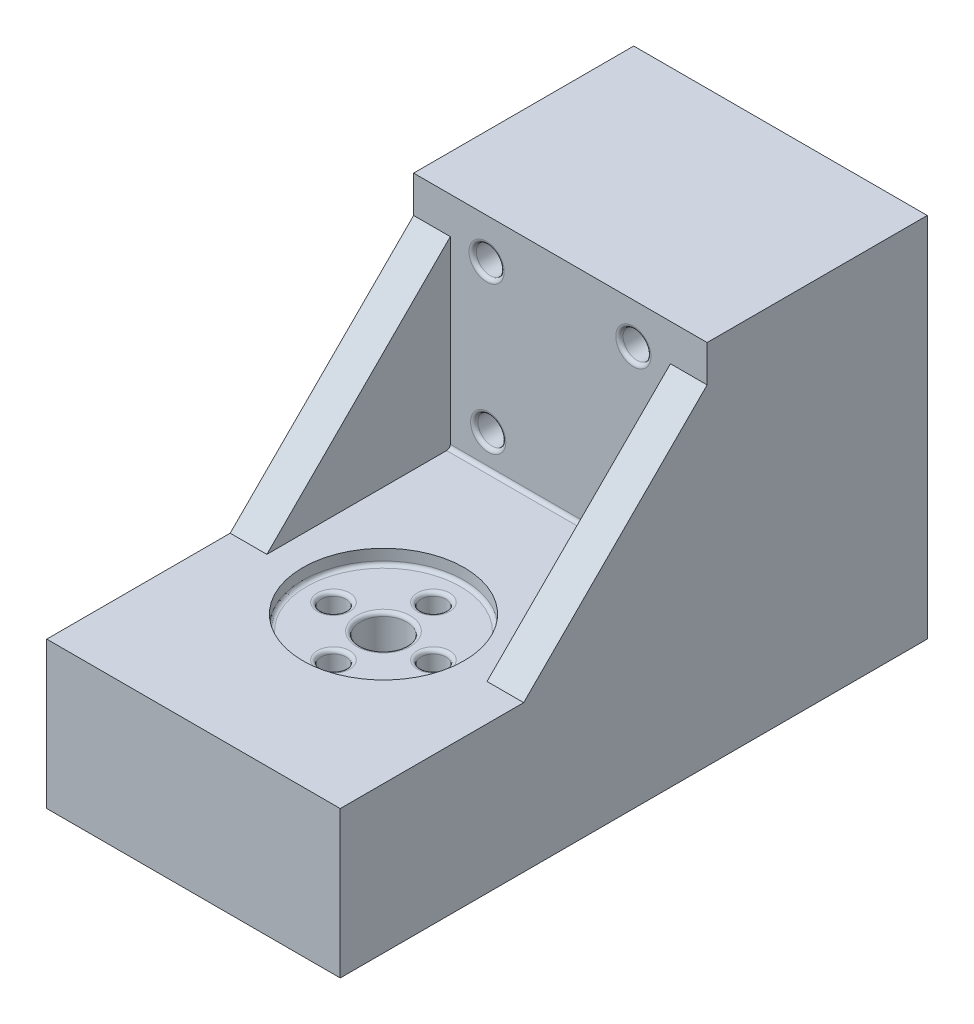
ISO-10303-21;
HEADER;
FILE_DESCRIPTION(('STEP AP214'),'2;1');
FILE_NAME('part.step','',(''),(''),'','','');
FILE_SCHEMA(('AUTOMOTIVE_DESIGN { 1 0 10303 214 1 1 1 1 }'));
ENDSEC;
DATA;
#1=APPLICATION_CONTEXT('core data for automotive mechanical design processes');
#2=APPLICATION_PROTOCOL_DEFINITION('international standard','automotive_design',2000,#1);
#3=PRODUCT_CONTEXT('',#1,'mechanical');
#4=PRODUCT('Part','Part','',(#3));
#5=PRODUCT_RELATED_PRODUCT_CATEGORY('part','',(#4));
#6=PRODUCT_DEFINITION_FORMATION('','',#4);
#7=PRODUCT_DEFINITION_CONTEXT('part definition',#1,'design');
#8=PRODUCT_DEFINITION('design','',#6,#7);
#9=PRODUCT_DEFINITION_SHAPE('','',#8);
#10=(LENGTH_UNIT() NAMED_UNIT(*) SI_UNIT(.MILLI.,.METRE.));
#11=(NAMED_UNIT(*) PLANE_ANGLE_UNIT() SI_UNIT($,.RADIAN.));
#12=(NAMED_UNIT(*) SI_UNIT($,.STERADIAN.) SOLID_ANGLE_UNIT());
#13=UNCERTAINTY_MEASURE_WITH_UNIT(LENGTH_MEASURE(1.E-05),#10,'distance_accuracy_value','');
#14=(GEOMETRIC_REPRESENTATION_CONTEXT(3) GLOBAL_UNCERTAINTY_ASSIGNED_CONTEXT((#13)) GLOBAL_UNIT_ASSIGNED_CONTEXT((#10,
#11,#12)) REPRESENTATION_CONTEXT('',''));
#15=CARTESIAN_POINT('',(0.,0.,0.));
#16=DIRECTION('',(0.,0.,1.));
#17=DIRECTION('',(1.,0.,0.));
#18=AXIS2_PLACEMENT_3D('',#15,#16,#17);
#19=CARTESIAN_POINT('',(5.,0.,0.));
#20=DIRECTION('',(1.,0.,0.));
#21=DIRECTION('',(0.,0.,-1.));
#22=AXIS2_PLACEMENT_3D('',#19,#20,#21);
#23=PLANE('',#22);
#24=DIRECTION('',(0.,0.,-1.));
#25=VECTOR('',#24,1.);
#26=CARTESIAN_POINT('',(5.,20.,0.));
#27=LINE('',#26,#25);
#28=CARTESIAN_POINT('',(5.,20.,25.));
#29=VERTEX_POINT('',#28);
#30=CARTESIAN_POINT('',(5.,20.,0.5));
#31=VERTEX_POINT('',#30);
#32=EDGE_CURVE('E66',#29,#31,#27,.T.);
#33=ORIENTED_EDGE('',*,*,#32,.T.);
#34=CARTESIAN_POINT('',(5.,20.5,0.5));
#35=DIRECTION('',(1.,0.,0.));
#36=DIRECTION('',(0.,0.,-1.));
#37=AXIS2_PLACEMENT_3D('',#34,#35,#36);
#38=CIRCLE('',#37,0.5);
#39=CARTESIAN_POINT('',(5.,20.5,0.));
#40=VERTEX_POINT('',#39);
#41=EDGE_CURVE('E273',#31,#40,#38,.T.);
#42=ORIENTED_EDGE('',*,*,#41,.T.);
#43=DIRECTION('',(0.,1.,0.));
#44=VECTOR('',#43,1.);
#45=CARTESIAN_POINT('',(5.,20.,0.));
#46=LINE('',#45,#44);
#47=CARTESIAN_POINT('',(5.,45.,0.));
#48=VERTEX_POINT('',#47);
#49=EDGE_CURVE('E285',#40,#48,#46,.T.);
#50=ORIENTED_EDGE('',*,*,#49,.T.);
#51=DIRECTION('',(0.,-0.707106781186547,0.707106781186548));
#52=VECTOR('',#51,1.);
#53=CARTESIAN_POINT('',(5.,20.,25.));
#54=LINE('',#53,#52);
#55=EDGE_CURVE('E278',#48,#29,#54,.T.);
#56=ORIENTED_EDGE('',*,*,#55,.T.);
#57=EDGE_LOOP('',(#33,#42,#50,#56));
#58=FACE_BOUND('',#57,.T.);
#59=ADVANCED_FACE('F50',(#58),#23,.T.);
#60=CARTESIAN_POINT('',(5.,20.,25.));
#61=DIRECTION('',(0.,-0.707106781186548,-0.707106781186547));
#62=DIRECTION('',(0.,0.707106781186547,-0.707106781186548));
#63=AXIS2_PLACEMENT_3D('',#60,#61,#62);
#64=PLANE('',#63);
#65=DIRECTION('',(0.,-0.707106781186547,0.707106781186548));
#66=VECTOR('',#65,1.);
#67=CARTESIAN_POINT('',(0.,20.,25.));
#68=LINE('',#67,#66);
#69=CARTESIAN_POINT('',(0.,45.,0.));
#70=VERTEX_POINT('',#69);
#71=CARTESIAN_POINT('',(0.,20.,25.));
#72=VERTEX_POINT('',#71);
#73=EDGE_CURVE('E279',#70,#72,#68,.T.);
#74=ORIENTED_EDGE('',*,*,#73,.T.);
#75=DIRECTION('',(-1.,0.,0.));
#76=VECTOR('',#75,1.);
#77=CARTESIAN_POINT('',(5.,20.,25.));
#78=LINE('',#77,#76);
#79=EDGE_CURVE('E11',#29,#72,#78,.T.);
#80=ORIENTED_EDGE('',*,*,#79,.F.);
#81=ORIENTED_EDGE('',*,*,#55,.F.);
#82=DIRECTION('',(-1.,0.,0.));
#83=VECTOR('',#82,1.);
#84=CARTESIAN_POINT('',(5.,45.,0.));
#85=LINE('',#84,#83);
#86=EDGE_CURVE('E54',#48,#70,#85,.T.);
#87=ORIENTED_EDGE('',*,*,#86,.T.);
#88=EDGE_LOOP('',(#74,#80,#81,#87));
#89=FACE_BOUND('',#88,.T.);
#90=ADVANCED_FACE('F47',(#89),#64,.F.);
#91=CARTESIAN_POINT('',(0.,0.,0.));
#92=DIRECTION('',(1.,0.,0.));
#93=DIRECTION('',(0.,0.,-1.));
#94=AXIS2_PLACEMENT_3D('',#91,#92,#93);
#95=PLANE('',#94);
#96=ORIENTED_EDGE('',*,*,#73,.F.);
#97=DIRECTION('',(0.,1.,0.));
#98=VECTOR('',#97,1.);
#99=CARTESIAN_POINT('',(0.,0.,0.));
#100=LINE('',#99,#98);
#101=CARTESIAN_POINT('',(0.,50.,0.));
#102=VERTEX_POINT('',#101);
#103=EDGE_CURVE('E158',#70,#102,#100,.T.);
#104=ORIENTED_EDGE('',*,*,#103,.T.);
#105=DIRECTION('',(0.,0.,1.));
#106=VECTOR('',#105,1.);
#107=CARTESIAN_POINT('',(0.,50.,-30.));
#108=LINE('',#107,#106);
#109=CARTESIAN_POINT('',(0.,50.,-30.));
#110=VERTEX_POINT('',#109);
#111=EDGE_CURVE('E173',#110,#102,#108,.T.);
#112=ORIENTED_EDGE('',*,*,#111,.F.);
#113=DIRECTION('',(0.,1.,0.));
#114=VECTOR('',#113,1.);
#115=CARTESIAN_POINT('',(0.,0.,-30.));
#116=LINE('',#115,#114);
#117=CARTESIAN_POINT('',(0.,0.,-30.));
#118=VERTEX_POINT('',#117);
#119=EDGE_CURVE('E150',#118,#110,#116,.T.);
#120=ORIENTED_EDGE('',*,*,#119,.F.);
#121=DIRECTION('',(0.,0.,-1.));
#122=VECTOR('',#121,1.);
#123=CARTESIAN_POINT('',(0.,0.,50.));
#124=LINE('',#123,#122);
#125=CARTESIAN_POINT('',(0.,0.,50.));
#126=VERTEX_POINT('',#125);
#127=EDGE_CURVE('E142',#126,#118,#124,.T.);
#128=ORIENTED_EDGE('',*,*,#127,.F.);
#129=DIRECTION('',(0.,-1.,0.));
#130=VECTOR('',#129,1.);
#131=CARTESIAN_POINT('',(0.,0.,50.));
#132=LINE('',#131,#130);
#133=CARTESIAN_POINT('',(0.,20.,50.));
#134=VERTEX_POINT('',#133);
#135=EDGE_CURVE('E185',#134,#126,#132,.T.);
#136=ORIENTED_EDGE('',*,*,#135,.F.);
#137=DIRECTION('',(0.,0.,-1.));
#138=VECTOR('',#137,1.);
#139=CARTESIAN_POINT('',(0.,20.,50.));
#140=LINE('',#139,#138);
#141=EDGE_CURVE('E188',#134,#72,#140,.T.);
#142=ORIENTED_EDGE('',*,*,#141,.T.);
#143=EDGE_LOOP('',(#96,#104,#112,#120,#128,#136,#142));
#144=FACE_BOUND('',#143,.T.);
#145=ADVANCED_FACE('F291',(#144),#95,.F.);
#146=CARTESIAN_POINT('',(0.,0.,0.));
#147=DIRECTION('',(0.,0.,1.));
#148=DIRECTION('',(1.,0.,0.));
#149=AXIS2_PLACEMENT_3D('',#146,#147,#148);
#150=PLANE('',#149);
#151=CARTESIAN_POINT('',(30.1625461377643,24.5208644291387,0.));
#152=DIRECTION('',(0.,0.,1.));
#153=DIRECTION('',(1.,0.,0.));
#154=AXIS2_PLACEMENT_3D('',#151,#152,#153);
#155=CIRCLE('',#154,2.39724105008004);
#156=CARTESIAN_POINT('',(32.5597871878444,24.5208644291387,0.));
#157=VERTEX_POINT('',#156);
#158=EDGE_CURVE('E210',#157,#157,#155,.F.);
#159=ORIENTED_EDGE('',*,*,#158,.T.);
#160=EDGE_LOOP('',(#159));
#161=FACE_BOUND('',#160,.T.);
#162=CARTESIAN_POINT('',(29.9459523419828,44.5196915729393,0.));
#163=DIRECTION('',(0.,0.,1.));
#164=DIRECTION('',(1.,0.,0.));
#165=AXIS2_PLACEMENT_3D('',#162,#163,#164);
#166=CIRCLE('',#165,2.39724105008004);
#167=CARTESIAN_POINT('',(32.3431933920629,44.5196915729393,0.));
#168=VERTEX_POINT('',#167);
#169=EDGE_CURVE('E202',#168,#168,#166,.F.);
#170=ORIENTED_EDGE('',*,*,#169,.T.);
#171=EDGE_LOOP('',(#170));
#172=FACE_BOUND('',#171,.T.);
#173=CARTESIAN_POINT('',(9.94595234198282,44.519691572939,0.));
#174=DIRECTION('',(0.,0.,1.));
#175=DIRECTION('',(1.,0.,0.));
#176=AXIS2_PLACEMENT_3D('',#173,#174,#175);
#177=CIRCLE('',#176,2.39724105008004);
#178=CARTESIAN_POINT('',(12.3431933920629,44.519691572939,0.));
#179=VERTEX_POINT('',#178);
#180=EDGE_CURVE('E201',#179,#179,#177,.F.);
#181=ORIENTED_EDGE('',*,*,#180,.T.);
#182=EDGE_LOOP('',(#181));
#183=FACE_BOUND('',#182,.T.);
#184=CARTESIAN_POINT('',(10.1625461377643,24.5208644291384,0.));
#185=DIRECTION('',(0.,0.,1.));
#186=DIRECTION('',(1.,0.,0.));
#187=AXIS2_PLACEMENT_3D('',#184,#185,#186);
#188=CIRCLE('',#187,2.39724105008004);
#189=CARTESIAN_POINT('',(12.5597871878444,24.5208644291384,0.));
#190=VERTEX_POINT('',#189);
#191=EDGE_CURVE('E199',#190,#190,#188,.F.);
#192=ORIENTED_EDGE('',*,*,#191,.T.);
#193=EDGE_LOOP('',(#192));
#194=FACE_BOUND('',#193,.T.);
#195=ORIENTED_EDGE('',*,*,#86,.F.);
#196=ORIENTED_EDGE('',*,*,#49,.F.);
#197=DIRECTION('',(-1.,0.,0.));
#198=VECTOR('',#197,1.);
#199=CARTESIAN_POINT('',(0.,20.5,0.));
#200=LINE('',#199,#198);
#201=CARTESIAN_POINT('',(35.,20.5,0.));
#202=VERTEX_POINT('',#201);
#203=EDGE_CURVE('E62',#40,#202,#200,.F.);
#204=ORIENTED_EDGE('',*,*,#203,.T.);
#205=DIRECTION('',(0.,-1.,0.));
#206=VECTOR('',#205,1.);
#207=CARTESIAN_POINT('',(35.,20.,0.));
#208=LINE('',#207,#206);
#209=CARTESIAN_POINT('',(35.,45.,0.));
#210=VERTEX_POINT('',#209);
#211=EDGE_CURVE('E261',#210,#202,#208,.T.);
#212=ORIENTED_EDGE('',*,*,#211,.F.);
#213=DIRECTION('',(1.,0.,0.));
#214=VECTOR('',#213,1.);
#215=CARTESIAN_POINT('',(35.,45.,0.));
#216=LINE('',#215,#214);
#217=CARTESIAN_POINT('',(40.,45.,0.));
#218=VERTEX_POINT('',#217);
#219=EDGE_CURVE('E275',#210,#218,#216,.T.);
#220=ORIENTED_EDGE('',*,*,#219,.T.);
#221=DIRECTION('',(0.,-1.,0.));
#222=VECTOR('',#221,1.);
#223=CARTESIAN_POINT('',(40.,0.,0.));
#224=LINE('',#223,#222);
#225=CARTESIAN_POINT('',(40.,50.,0.));
#226=VERTEX_POINT('',#225);
#227=EDGE_CURVE('E170',#226,#218,#224,.T.);
#228=ORIENTED_EDGE('',*,*,#227,.F.);
#229=DIRECTION('',(1.,0.,0.));
#230=VECTOR('',#229,1.);
#231=CARTESIAN_POINT('',(40.,50.,0.));
#232=LINE('',#231,#230);
#233=EDGE_CURVE('E156',#102,#226,#232,.T.);
#234=ORIENTED_EDGE('',*,*,#233,.F.);
#235=ORIENTED_EDGE('',*,*,#103,.F.);
#236=EDGE_LOOP('',(#195,#196,#204,#212,#220,#228,#234,#235));
#237=FACE_BOUND('',#236,.T.);
#238=ADVANCED_FACE('F307',(#161,#172,#183,#194,#237),#150,.T.);
#239=CARTESIAN_POINT('',(35.,0.,0.));
#240=DIRECTION('',(1.,0.,0.));
#241=DIRECTION('',(0.,0.,-1.));
#242=AXIS2_PLACEMENT_3D('',#239,#240,#241);
#243=PLANE('',#242);
#244=CARTESIAN_POINT('',(35.,20.5,0.5));
#245=DIRECTION('',(1.,0.,0.));
#246=DIRECTION('',(0.,0.,-1.));
#247=AXIS2_PLACEMENT_3D('',#244,#245,#246);
#248=CIRCLE('',#247,0.5);
#249=CARTESIAN_POINT('',(35.,20.,0.5));
#250=VERTEX_POINT('',#249);
#251=EDGE_CURVE('E258',#250,#202,#248,.T.);
#252=ORIENTED_EDGE('',*,*,#251,.F.);
#253=DIRECTION('',(0.,0.,1.));
#254=VECTOR('',#253,1.);
#255=CARTESIAN_POINT('',(35.,20.,0.));
#256=LINE('',#255,#254);
#257=CARTESIAN_POINT('',(35.,20.,25.));
#258=VERTEX_POINT('',#257);
#259=EDGE_CURVE('E270',#250,#258,#256,.T.);
#260=ORIENTED_EDGE('',*,*,#259,.T.);
#261=DIRECTION('',(0.,0.707106781186547,-0.707106781186548));
#262=VECTOR('',#261,1.);
#263=CARTESIAN_POINT('',(35.,20.,25.));
#264=LINE('',#263,#262);
#265=EDGE_CURVE('E265',#258,#210,#264,.T.);
#266=ORIENTED_EDGE('',*,*,#265,.T.);
#267=ORIENTED_EDGE('',*,*,#211,.T.);
#268=EDGE_LOOP('',(#252,#260,#266,#267));
#269=FACE_BOUND('',#268,.T.);
#270=ADVANCED_FACE('F315',(#269),#243,.F.);
#271=CARTESIAN_POINT('',(35.,20.,25.));
#272=DIRECTION('',(0.,-0.707106781186548,-0.707106781186547));
#273=DIRECTION('',(0.,0.707106781186547,-0.707106781186548));
#274=AXIS2_PLACEMENT_3D('',#271,#272,#273);
#275=PLANE('',#274);
#276=DIRECTION('',(0.,0.707106781186547,-0.707106781186548));
#277=VECTOR('',#276,1.);
#278=CARTESIAN_POINT('',(40.,20.,25.));
#279=LINE('',#278,#277);
#280=CARTESIAN_POINT('',(40.,20.,25.));
#281=VERTEX_POINT('',#280);
#282=EDGE_CURVE('E262',#281,#218,#279,.T.);
#283=ORIENTED_EDGE('',*,*,#282,.T.);
#284=ORIENTED_EDGE('',*,*,#219,.F.);
#285=ORIENTED_EDGE('',*,*,#265,.F.);
#286=DIRECTION('',(1.,0.,0.));
#287=VECTOR('',#286,1.);
#288=CARTESIAN_POINT('',(35.,20.,25.));
#289=LINE('',#288,#287);
#290=EDGE_CURVE('E267',#258,#281,#289,.T.);
#291=ORIENTED_EDGE('',*,*,#290,.T.);
#292=EDGE_LOOP('',(#283,#284,#285,#291));
#293=FACE_BOUND('',#292,.T.);
#294=ADVANCED_FACE('F306',(#293),#275,.F.);
#295=CARTESIAN_POINT('',(40.,0.,0.));
#296=DIRECTION('',(1.,0.,0.));
#297=DIRECTION('',(0.,0.,-1.));
#298=AXIS2_PLACEMENT_3D('',#295,#296,#297);
#299=PLANE('',#298);
#300=ORIENTED_EDGE('',*,*,#282,.F.);
#301=DIRECTION('',(0.,0.,-1.));
#302=VECTOR('',#301,1.);
#303=CARTESIAN_POINT('',(40.,20.,50.));
#304=LINE('',#303,#302);
#305=CARTESIAN_POINT('',(40.,20.,50.));
#306=VERTEX_POINT('',#305);
#307=EDGE_CURVE('E145',#306,#281,#304,.T.);
#308=ORIENTED_EDGE('',*,*,#307,.F.);
#309=DIRECTION('',(0.,1.,0.));
#310=VECTOR('',#309,1.);
#311=CARTESIAN_POINT('',(40.,0.,50.));
#312=LINE('',#311,#310);
#313=CARTESIAN_POINT('',(40.,0.,50.));
#314=VERTEX_POINT('',#313);
#315=EDGE_CURVE('E137',#314,#306,#312,.T.);
#316=ORIENTED_EDGE('',*,*,#315,.F.);
#317=DIRECTION('',(0.,0.,-1.));
#318=VECTOR('',#317,1.);
#319=CARTESIAN_POINT('',(40.,0.,50.));
#320=LINE('',#319,#318);
#321=CARTESIAN_POINT('',(40.,0.,-30.));
#322=VERTEX_POINT('',#321);
#323=EDGE_CURVE('E132',#314,#322,#320,.T.);
#324=ORIENTED_EDGE('',*,*,#323,.T.);
#325=DIRECTION('',(0.,-1.,0.));
#326=VECTOR('',#325,1.);
#327=CARTESIAN_POINT('',(40.,0.,-30.));
#328=LINE('',#327,#326);
#329=CARTESIAN_POINT('',(40.,50.,-30.));
#330=VERTEX_POINT('',#329);
#331=EDGE_CURVE('E140',#330,#322,#328,.T.);
#332=ORIENTED_EDGE('',*,*,#331,.F.);
#333=DIRECTION('',(0.,0.,1.));
#334=VECTOR('',#333,1.);
#335=CARTESIAN_POINT('',(40.,50.,-30.));
#336=LINE('',#335,#334);
#337=EDGE_CURVE('E168',#330,#226,#336,.T.);
#338=ORIENTED_EDGE('',*,*,#337,.T.);
#339=ORIENTED_EDGE('',*,*,#227,.T.);
#340=EDGE_LOOP('',(#300,#308,#316,#324,#332,#338,#339));
#341=FACE_BOUND('',#340,.T.);
#342=ADVANCED_FACE('F131',(#341),#299,.T.);
#343=CARTESIAN_POINT('',(0.,20.5,0.5));
#344=DIRECTION('',(-1.,0.,0.));
#345=DIRECTION('',(0.,0.,1.));
#346=AXIS2_PLACEMENT_3D('',#343,#344,#345);
#347=CYLINDRICAL_SURFACE('',#346,0.5);
#348=ORIENTED_EDGE('',*,*,#41,.F.);
#349=DIRECTION('',(-1.,0.,0.));
#350=VECTOR('',#349,1.);
#351=CARTESIAN_POINT('',(0.,20.,0.5));
#352=LINE('',#351,#350);
#353=EDGE_CURVE('E197',#250,#31,#352,.T.);
#354=ORIENTED_EDGE('',*,*,#353,.F.);
#355=ORIENTED_EDGE('',*,*,#251,.T.);
#356=ORIENTED_EDGE('',*,*,#203,.F.);
#357=EDGE_LOOP('',(#348,#354,#355,#356));
#358=FACE_BOUND('',#357,.T.);
#359=ADVANCED_FACE('F314',(#358),#347,.F.);
#360=CARTESIAN_POINT('',(20.,0.,24.1090490320936));
#361=DIRECTION('',(0.,1.,0.));
#362=DIRECTION('',(0.,0.,1.));
#363=AXIS2_PLACEMENT_3D('',#360,#361,#362);
#364=CYLINDRICAL_SURFACE('',#363,3.15);
#365=CARTESIAN_POINT('',(20.,17.5,24.1090490320936));
#366=DIRECTION('',(0.,1.,0.));
#367=DIRECTION('',(0.,0.,1.));
#368=AXIS2_PLACEMENT_3D('',#365,#366,#367);
#369=CIRCLE('',#368,3.15);
#370=CARTESIAN_POINT('',(20.,17.5,27.2590490320936));
#371=VERTEX_POINT('',#370);
#372=EDGE_CURVE('E242',#371,#371,#369,.T.);
#373=ORIENTED_EDGE('',*,*,#372,.T.);
#374=EDGE_LOOP('',(#373));
#375=FACE_BOUND('',#374,.T.);
#376=CARTESIAN_POINT('',(20.,0.,24.1090490320936));
#377=DIRECTION('',(0.,1.,0.));
#378=DIRECTION('',(0.,0.,1.));
#379=AXIS2_PLACEMENT_3D('',#376,#377,#378);
#380=CIRCLE('',#379,3.15);
#381=CARTESIAN_POINT('',(20.,0.,27.2590490320936));
#382=VERTEX_POINT('',#381);
#383=EDGE_CURVE('E177',#382,#382,#380,.T.);
#384=ORIENTED_EDGE('',*,*,#383,.F.);
#385=EDGE_LOOP('',(#384));
#386=FACE_BOUND('',#385,.T.);
#387=ADVANCED_FACE('F350',(#375,#386),#364,.F.);
#388=CARTESIAN_POINT('',(0.,0.,50.));
#389=DIRECTION('',(0.,1.,0.));
#390=DIRECTION('',(0.,0.,1.));
#391=AXIS2_PLACEMENT_3D('',#388,#389,#390);
#392=PLANE('',#391);
#393=CARTESIAN_POINT('',(20.,0.,17.2970809618464));
#394=DIRECTION('',(0.,1.,0.));
#395=DIRECTION('',(0.,0.,1.));
#396=AXIS2_PLACEMENT_3D('',#393,#394,#395);
#397=CIRCLE('',#396,1.7);
#398=CARTESIAN_POINT('',(20.,0.,18.9970809618464));
#399=VERTEX_POINT('',#398);
#400=EDGE_CURVE('E167',#399,#399,#397,.T.);
#401=ORIENTED_EDGE('',*,*,#400,.T.);
#402=EDGE_LOOP('',(#401));
#403=FACE_BOUND('',#402,.T.);
#404=CARTESIAN_POINT('',(26.8119680702474,0.,24.1090490320936));
#405=DIRECTION('',(0.,1.,0.));
#406=DIRECTION('',(0.,0.,1.));
#407=AXIS2_PLACEMENT_3D('',#404,#405,#406);
#408=CIRCLE('',#407,1.7);
#409=CARTESIAN_POINT('',(26.8119680702474,0.,25.8090490320936));
#410=VERTEX_POINT('',#409);
#411=EDGE_CURVE('E706',#410,#410,#408,.T.);
#412=ORIENTED_EDGE('',*,*,#411,.T.);
#413=EDGE_LOOP('',(#412));
#414=FACE_BOUND('',#413,.T.);
#415=CARTESIAN_POINT('',(20.0000000000001,0.,30.9210171023409));
#416=DIRECTION('',(0.,1.,0.));
#417=DIRECTION('',(0.,0.,1.));
#418=AXIS2_PLACEMENT_3D('',#415,#416,#417);
#419=CIRCLE('',#418,1.7);
#420=CARTESIAN_POINT('',(20.0000000000001,0.,32.6210171023409));
#421=VERTEX_POINT('',#420);
#422=EDGE_CURVE('E705',#421,#421,#419,.T.);
#423=ORIENTED_EDGE('',*,*,#422,.T.);
#424=EDGE_LOOP('',(#423));
#425=FACE_BOUND('',#424,.T.);
#426=CARTESIAN_POINT('',(13.1880319297528,0.,24.1090490320937));
#427=DIRECTION('',(0.,1.,0.));
#428=DIRECTION('',(0.,0.,1.));
#429=AXIS2_PLACEMENT_3D('',#426,#427,#428);
#430=CIRCLE('',#429,1.7);
#431=CARTESIAN_POINT('',(13.1880319297528,0.,25.8090490320937));
#432=VERTEX_POINT('',#431);
#433=EDGE_CURVE('E163',#432,#432,#430,.T.);
#434=ORIENTED_EDGE('',*,*,#433,.T.);
#435=EDGE_LOOP('',(#434));
#436=FACE_BOUND('',#435,.T.);
#437=ORIENTED_EDGE('',*,*,#383,.T.);
#438=EDGE_LOOP('',(#437));
#439=FACE_BOUND('',#438,.T.);
#440=ORIENTED_EDGE('',*,*,#127,.T.);
#441=DIRECTION('',(-1.,0.,0.));
#442=VECTOR('',#441,1.);
#443=CARTESIAN_POINT('',(40.,0.,-30.));
#444=LINE('',#443,#442);
#445=EDGE_CURVE('E143',#322,#118,#444,.T.);
#446=ORIENTED_EDGE('',*,*,#445,.F.);
#447=ORIENTED_EDGE('',*,*,#323,.F.);
#448=DIRECTION('',(1.,0.,0.));
#449=VECTOR('',#448,1.);
#450=CARTESIAN_POINT('',(0.,0.,50.));
#451=LINE('',#450,#449);
#452=EDGE_CURVE('E184',#126,#314,#451,.T.);
#453=ORIENTED_EDGE('',*,*,#452,.F.);
#454=EDGE_LOOP('',(#440,#446,#447,#453));
#455=FACE_BOUND('',#454,.T.);
#456=ADVANCED_FACE('F146',(#403,#414,#425,#436,#439,#455),#392,.F.);
#457=CARTESIAN_POINT('',(0.,20.,50.));
#458=DIRECTION('',(0.,-1.,0.));
#459=DIRECTION('',(0.,0.,-1.));
#460=AXIS2_PLACEMENT_3D('',#457,#458,#459);
#461=PLANE('',#460);
#462=ORIENTED_EDGE('',*,*,#32,.F.);
#463=ORIENTED_EDGE('',*,*,#79,.T.);
#464=ORIENTED_EDGE('',*,*,#141,.F.);
#465=DIRECTION('',(-1.,0.,0.));
#466=VECTOR('',#465,1.);
#467=CARTESIAN_POINT('',(0.,20.,50.));
#468=LINE('',#467,#466);
#469=EDGE_CURVE('E189',#306,#134,#468,.T.);
#470=ORIENTED_EDGE('',*,*,#469,.F.);
#471=ORIENTED_EDGE('',*,*,#307,.T.);
#472=ORIENTED_EDGE('',*,*,#290,.F.);
#473=ORIENTED_EDGE('',*,*,#259,.F.);
#474=ORIENTED_EDGE('',*,*,#353,.T.);
#475=EDGE_LOOP('',(#462,#463,#464,#470,#471,#472,#473,#474));
#476=FACE_BOUND('',#475,.T.);
#477=CARTESIAN_POINT('',(20.,20.,24.1090490320936));
#478=DIRECTION('',(0.,1.,0.));
#479=DIRECTION('',(0.,0.,1.));
#480=AXIS2_PLACEMENT_3D('',#477,#478,#479);
#481=CIRCLE('',#480,11.);
#482=CARTESIAN_POINT('',(20.,20.,35.1090490320936));
#483=VERTEX_POINT('',#482);
#484=EDGE_CURVE('E176',#483,#483,#481,.T.);
#485=ORIENTED_EDGE('',*,*,#484,.F.);
#486=EDGE_LOOP('',(#485));
#487=FACE_BOUND('',#486,.T.);
#488=ADVANCED_FACE('F296',(#476,#487),#461,.F.);
#489=CARTESIAN_POINT('',(0.,0.,50.));
#490=DIRECTION('',(0.,0.,-1.));
#491=DIRECTION('',(-1.,0.,0.));
#492=AXIS2_PLACEMENT_3D('',#489,#490,#491);
#493=PLANE('',#492);
#494=ORIENTED_EDGE('',*,*,#135,.T.);
#495=ORIENTED_EDGE('',*,*,#452,.T.);
#496=ORIENTED_EDGE('',*,*,#315,.T.);
#497=ORIENTED_EDGE('',*,*,#469,.T.);
#498=EDGE_LOOP('',(#494,#495,#496,#497));
#499=FACE_BOUND('',#498,.T.);
#500=ADVANCED_FACE('F305',(#499),#493,.F.);
#501=CARTESIAN_POINT('',(20.,18.,24.1090490320936));
#502=DIRECTION('',(0.,1.,0.));
#503=DIRECTION('',(0.,0.,1.));
#504=AXIS2_PLACEMENT_3D('',#501,#502,#503);
#505=PLANE('',#504);
#506=CARTESIAN_POINT('',(20.,18.,24.1090490320936));
#507=DIRECTION('',(0.,1.,0.));
#508=DIRECTION('',(0.,0.,1.));
#509=AXIS2_PLACEMENT_3D('',#506,#507,#508);
#510=CIRCLE('',#509,3.65);
#511=CARTESIAN_POINT('',(20.,18.,27.7590490320936));
#512=VERTEX_POINT('',#511);
#513=EDGE_CURVE('E241',#512,#512,#510,.F.);
#514=ORIENTED_EDGE('',*,*,#513,.T.);
#515=EDGE_LOOP('',(#514));
#516=FACE_BOUND('',#515,.T.);
#517=CARTESIAN_POINT('',(20.,18.,17.2970809618464));
#518=DIRECTION('',(0.,1.,0.));
#519=DIRECTION('',(0.,0.,1.));
#520=AXIS2_PLACEMENT_3D('',#517,#518,#519);
#521=CIRCLE('',#520,2.2);
#522=CARTESIAN_POINT('',(20.,18.,19.4970809618464));
#523=VERTEX_POINT('',#522);
#524=EDGE_CURVE('E238',#523,#523,#521,.F.);
#525=ORIENTED_EDGE('',*,*,#524,.T.);
#526=EDGE_LOOP('',(#525));
#527=FACE_BOUND('',#526,.T.);
#528=CARTESIAN_POINT('',(13.1880319297528,18.,24.1090490320937));
#529=DIRECTION('',(0.,1.,0.));
#530=DIRECTION('',(0.,0.,1.));
#531=AXIS2_PLACEMENT_3D('',#528,#529,#530);
#532=CIRCLE('',#531,2.2);
#533=CARTESIAN_POINT('',(13.1880319297528,18.,26.3090490320937));
#534=VERTEX_POINT('',#533);
#535=EDGE_CURVE('E232',#534,#534,#532,.F.);
#536=ORIENTED_EDGE('',*,*,#535,.T.);
#537=EDGE_LOOP('',(#536));
#538=FACE_BOUND('',#537,.T.);
#539=CARTESIAN_POINT('',(20.0000000000001,18.,30.9210171023409));
#540=DIRECTION('',(0.,1.,0.));
#541=DIRECTION('',(0.,0.,1.));
#542=AXIS2_PLACEMENT_3D('',#539,#540,#541);
#543=CIRCLE('',#542,2.2);
#544=CARTESIAN_POINT('',(20.0000000000001,18.,33.1210171023409));
#545=VERTEX_POINT('',#544);
#546=EDGE_CURVE('E235',#545,#545,#543,.F.);
#547=ORIENTED_EDGE('',*,*,#546,.T.);
#548=EDGE_LOOP('',(#547));
#549=FACE_BOUND('',#548,.T.);
#550=CARTESIAN_POINT('',(26.8119680702474,18.,24.1090490320936));
#551=DIRECTION('',(0.,1.,0.));
#552=DIRECTION('',(0.,0.,1.));
#553=AXIS2_PLACEMENT_3D('',#550,#551,#552);
#554=CIRCLE('',#553,2.2);
#555=CARTESIAN_POINT('',(26.8119680702474,18.,26.3090490320936));
#556=VERTEX_POINT('',#555);
#557=EDGE_CURVE('E230',#556,#556,#554,.F.);
#558=ORIENTED_EDGE('',*,*,#557,.T.);
#559=EDGE_LOOP('',(#558));
#560=FACE_BOUND('',#559,.T.);
#561=CARTESIAN_POINT('',(20.,18.,24.1090490320936));
#562=DIRECTION('',(0.,1.,0.));
#563=DIRECTION('',(0.,0.,1.));
#564=AXIS2_PLACEMENT_3D('',#561,#562,#563);
#565=CIRCLE('',#564,10.5);
#566=CARTESIAN_POINT('',(20.,18.,34.6090490320936));
#567=VERTEX_POINT('',#566);
#568=EDGE_CURVE('E223',#567,#567,#565,.T.);
#569=ORIENTED_EDGE('',*,*,#568,.T.);
#570=EDGE_LOOP('',(#569));
#571=FACE_BOUND('',#570,.T.);
#572=ADVANCED_FACE('F338',(#516,#527,#538,#549,#560,#571),#505,.T.);
#573=CARTESIAN_POINT('',(20.,18.,24.1090490320936));
#574=DIRECTION('',(0.,1.,0.));
#575=DIRECTION('',(0.,0.,1.));
#576=AXIS2_PLACEMENT_3D('',#573,#574,#575);
#577=CYLINDRICAL_SURFACE('',#576,11.);
#578=CARTESIAN_POINT('',(20.,18.5,24.1090490320936));
#579=DIRECTION('',(0.,1.,0.));
#580=DIRECTION('',(0.,0.,1.));
#581=AXIS2_PLACEMENT_3D('',#578,#579,#580);
#582=CIRCLE('',#581,11.);
#583=CARTESIAN_POINT('',(20.,18.5,35.1090490320936));
#584=VERTEX_POINT('',#583);
#585=EDGE_CURVE('E228',#584,#584,#582,.F.);
#586=ORIENTED_EDGE('',*,*,#585,.T.);
#587=EDGE_LOOP('',(#586));
#588=FACE_BOUND('',#587,.T.);
#589=ORIENTED_EDGE('',*,*,#484,.T.);
#590=EDGE_LOOP('',(#589));
#591=FACE_BOUND('',#590,.T.);
#592=ADVANCED_FACE('F336',(#588,#591),#577,.F.);
#593=CARTESIAN_POINT('',(40.,50.,-30.));
#594=DIRECTION('',(0.,-1.,0.));
#595=DIRECTION('',(0.,0.,-1.));
#596=AXIS2_PLACEMENT_3D('',#593,#594,#595);
#597=PLANE('',#596);
#598=ORIENTED_EDGE('',*,*,#233,.T.);
#599=ORIENTED_EDGE('',*,*,#337,.F.);
#600=DIRECTION('',(1.,0.,0.));
#601=VECTOR('',#600,1.);
#602=CARTESIAN_POINT('',(40.,50.,-30.));
#603=LINE('',#602,#601);
#604=EDGE_CURVE('E151',#110,#330,#603,.T.);
#605=ORIENTED_EDGE('',*,*,#604,.F.);
#606=ORIENTED_EDGE('',*,*,#111,.T.);
#607=EDGE_LOOP('',(#598,#599,#605,#606));
#608=FACE_BOUND('',#607,.T.);
#609=ADVANCED_FACE('F334',(#608),#597,.F.);
#610=CARTESIAN_POINT('',(0.,0.,-30.));
#611=DIRECTION('',(0.,0.,1.));
#612=DIRECTION('',(1.,0.,0.));
#613=AXIS2_PLACEMENT_3D('',#610,#611,#612);
#614=PLANE('',#613);
#615=CARTESIAN_POINT('',(10.1625461377643,24.5208644291384,-30.));
#616=DIRECTION('',(0.,0.,1.));
#617=DIRECTION('',(1.,0.,0.));
#618=AXIS2_PLACEMENT_3D('',#615,#616,#617);
#619=CIRCLE('',#618,1.89724105008004);
#620=CARTESIAN_POINT('',(12.0597871878444,24.5208644291384,-30.));
#621=VERTEX_POINT('',#620);
#622=EDGE_CURVE('E690',#621,#621,#619,.T.);
#623=ORIENTED_EDGE('',*,*,#622,.T.);
#624=EDGE_LOOP('',(#623));
#625=FACE_BOUND('',#624,.T.);
#626=CARTESIAN_POINT('',(30.1625461377643,24.5208644291387,-30.));
#627=DIRECTION('',(0.,0.,1.));
#628=DIRECTION('',(1.,0.,0.));
#629=AXIS2_PLACEMENT_3D('',#626,#627,#628);
#630=CIRCLE('',#629,1.89724105008004);
#631=CARTESIAN_POINT('',(32.0597871878444,24.5208644291387,-30.));
#632=VERTEX_POINT('',#631);
#633=EDGE_CURVE('E691',#632,#632,#630,.T.);
#634=ORIENTED_EDGE('',*,*,#633,.T.);
#635=EDGE_LOOP('',(#634));
#636=FACE_BOUND('',#635,.T.);
#637=CARTESIAN_POINT('',(29.9459523419828,44.5196915729393,-30.));
#638=DIRECTION('',(0.,0.,1.));
#639=DIRECTION('',(1.,0.,0.));
#640=AXIS2_PLACEMENT_3D('',#637,#638,#639);
#641=CIRCLE('',#640,1.89724105008004);
#642=CARTESIAN_POINT('',(31.8431933920629,44.5196915729393,-30.));
#643=VERTEX_POINT('',#642);
#644=EDGE_CURVE('E694',#643,#643,#641,.T.);
#645=ORIENTED_EDGE('',*,*,#644,.T.);
#646=EDGE_LOOP('',(#645));
#647=FACE_BOUND('',#646,.T.);
#648=CARTESIAN_POINT('',(9.94595234198282,44.519691572939,-30.));
#649=DIRECTION('',(0.,0.,1.));
#650=DIRECTION('',(1.,0.,0.));
#651=AXIS2_PLACEMENT_3D('',#648,#649,#650);
#652=CIRCLE('',#651,1.89724105008004);
#653=CARTESIAN_POINT('',(11.8431933920629,44.519691572939,-30.));
#654=VERTEX_POINT('',#653);
#655=EDGE_CURVE('E698',#654,#654,#652,.T.);
#656=ORIENTED_EDGE('',*,*,#655,.T.);
#657=EDGE_LOOP('',(#656));
#658=FACE_BOUND('',#657,.T.);
#659=ORIENTED_EDGE('',*,*,#331,.T.);
#660=ORIENTED_EDGE('',*,*,#445,.T.);
#661=ORIENTED_EDGE('',*,*,#119,.T.);
#662=ORIENTED_EDGE('',*,*,#604,.T.);
#663=EDGE_LOOP('',(#659,#660,#661,#662));
#664=FACE_BOUND('',#663,.T.);
#665=ADVANCED_FACE('F155',(#625,#636,#647,#658,#664),#614,.F.);
#666=CARTESIAN_POINT('',(13.1880319297528,0.,24.1090490320937));
#667=DIRECTION('',(0.,1.,0.));
#668=DIRECTION('',(0.,0.,1.));
#669=AXIS2_PLACEMENT_3D('',#666,#667,#668);
#670=CYLINDRICAL_SURFACE('',#669,1.7);
#671=CARTESIAN_POINT('',(13.1880319297528,17.5,24.1090490320937));
#672=DIRECTION('',(0.,1.,0.));
#673=DIRECTION('',(0.,0.,1.));
#674=AXIS2_PLACEMENT_3D('',#671,#672,#673);
#675=CIRCLE('',#674,1.7);
#676=CARTESIAN_POINT('',(13.1880319297528,17.5,25.8090490320937));
#677=VERTEX_POINT('',#676);
#678=EDGE_CURVE('E249',#677,#677,#675,.T.);
#679=ORIENTED_EDGE('',*,*,#678,.T.);
#680=EDGE_LOOP('',(#679));
#681=FACE_BOUND('',#680,.T.);
#682=ORIENTED_EDGE('',*,*,#433,.F.);
#683=EDGE_LOOP('',(#682));
#684=FACE_BOUND('',#683,.T.);
#685=ADVANCED_FACE('F569',(#681,#684),#670,.F.);
#686=CARTESIAN_POINT('',(20.0000000000001,0.,30.9210171023409));
#687=DIRECTION('',(0.,1.,0.));
#688=DIRECTION('',(0.,0.,1.));
#689=AXIS2_PLACEMENT_3D('',#686,#687,#688);
#690=CYLINDRICAL_SURFACE('',#689,1.7);
#691=CARTESIAN_POINT('',(20.0000000000001,17.5,30.9210171023409));
#692=DIRECTION('',(0.,1.,0.));
#693=DIRECTION('',(0.,0.,1.));
#694=AXIS2_PLACEMENT_3D('',#691,#692,#693);
#695=CIRCLE('',#694,1.7);
#696=CARTESIAN_POINT('',(20.0000000000001,17.5,32.6210171023409));
#697=VERTEX_POINT('',#696);
#698=EDGE_CURVE('E254',#697,#697,#695,.T.);
#699=ORIENTED_EDGE('',*,*,#698,.T.);
#700=EDGE_LOOP('',(#699));
#701=FACE_BOUND('',#700,.T.);
#702=ORIENTED_EDGE('',*,*,#422,.F.);
#703=EDGE_LOOP('',(#702));
#704=FACE_BOUND('',#703,.T.);
#705=ADVANCED_FACE('F557',(#701,#704),#690,.F.);
#706=CARTESIAN_POINT('',(26.8119680702474,0.,24.1090490320936));
#707=DIRECTION('',(0.,1.,0.));
#708=DIRECTION('',(0.,0.,1.));
#709=AXIS2_PLACEMENT_3D('',#706,#707,#708);
#710=CYLINDRICAL_SURFACE('',#709,1.7);
#711=CARTESIAN_POINT('',(26.8119680702474,17.5,24.1090490320936));
#712=DIRECTION('',(0.,1.,0.));
#713=DIRECTION('',(0.,0.,1.));
#714=AXIS2_PLACEMENT_3D('',#711,#712,#713);
#715=CIRCLE('',#714,1.7);
#716=CARTESIAN_POINT('',(26.8119680702474,17.5,25.8090490320936));
#717=VERTEX_POINT('',#716);
#718=EDGE_CURVE('E256',#717,#717,#715,.T.);
#719=ORIENTED_EDGE('',*,*,#718,.T.);
#720=EDGE_LOOP('',(#719));
#721=FACE_BOUND('',#720,.T.);
#722=ORIENTED_EDGE('',*,*,#411,.F.);
#723=EDGE_LOOP('',(#722));
#724=FACE_BOUND('',#723,.T.);
#725=ADVANCED_FACE('F549',(#721,#724),#710,.F.);
#726=CARTESIAN_POINT('',(20.,0.,17.2970809618464));
#727=DIRECTION('',(0.,1.,0.));
#728=DIRECTION('',(0.,0.,1.));
#729=AXIS2_PLACEMENT_3D('',#726,#727,#728);
#730=CYLINDRICAL_SURFACE('',#729,1.7);
#731=CARTESIAN_POINT('',(20.,17.5,17.2970809618464));
#732=DIRECTION('',(0.,1.,0.));
#733=DIRECTION('',(0.,0.,1.));
#734=AXIS2_PLACEMENT_3D('',#731,#732,#733);
#735=CIRCLE('',#734,1.7);
#736=CARTESIAN_POINT('',(20.,17.5,18.9970809618464));
#737=VERTEX_POINT('',#736);
#738=EDGE_CURVE('E250',#737,#737,#735,.T.);
#739=ORIENTED_EDGE('',*,*,#738,.T.);
#740=EDGE_LOOP('',(#739));
#741=FACE_BOUND('',#740,.T.);
#742=ORIENTED_EDGE('',*,*,#400,.F.);
#743=EDGE_LOOP('',(#742));
#744=FACE_BOUND('',#743,.T.);
#745=ADVANCED_FACE('F540',(#741,#744),#730,.F.);
#746=CARTESIAN_POINT('',(9.94595234198282,44.519691572939,-30.));
#747=DIRECTION('',(0.,0.,1.));
#748=DIRECTION('',(1.,0.,0.));
#749=AXIS2_PLACEMENT_3D('',#746,#747,#748);
#750=CYLINDRICAL_SURFACE('',#749,1.89724105008004);
#751=CARTESIAN_POINT('',(9.94595234198282,44.519691572939,-0.5));
#752=DIRECTION('',(0.,0.,1.));
#753=DIRECTION('',(1.,0.,0.));
#754=AXIS2_PLACEMENT_3D('',#751,#752,#753);
#755=CIRCLE('',#754,1.89724105008004);
#756=CARTESIAN_POINT('',(11.8431933920629,44.519691572939,-0.5));
#757=VERTEX_POINT('',#756);
#758=EDGE_CURVE('E220',#757,#757,#755,.T.);
#759=ORIENTED_EDGE('',*,*,#758,.T.);
#760=EDGE_LOOP('',(#759));
#761=FACE_BOUND('',#760,.T.);
#762=ORIENTED_EDGE('',*,*,#655,.F.);
#763=EDGE_LOOP('',(#762));
#764=FACE_BOUND('',#763,.T.);
#765=ADVANCED_FACE('F529',(#761,#764),#750,.F.);
#766=CARTESIAN_POINT('',(29.9459523419828,44.5196915729393,-30.));
#767=DIRECTION('',(0.,0.,1.));
#768=DIRECTION('',(1.,0.,0.));
#769=AXIS2_PLACEMENT_3D('',#766,#767,#768);
#770=CYLINDRICAL_SURFACE('',#769,1.89724105008004);
#771=CARTESIAN_POINT('',(29.9459523419828,44.5196915729393,-0.5));
#772=DIRECTION('',(0.,0.,1.));
#773=DIRECTION('',(1.,0.,0.));
#774=AXIS2_PLACEMENT_3D('',#771,#772,#773);
#775=CIRCLE('',#774,1.89724105008004);
#776=CARTESIAN_POINT('',(31.8431933920629,44.5196915729393,-0.5));
#777=VERTEX_POINT('',#776);
#778=EDGE_CURVE('E213',#777,#777,#775,.T.);
#779=ORIENTED_EDGE('',*,*,#778,.T.);
#780=EDGE_LOOP('',(#779));
#781=FACE_BOUND('',#780,.T.);
#782=ORIENTED_EDGE('',*,*,#644,.F.);
#783=EDGE_LOOP('',(#782));
#784=FACE_BOUND('',#783,.T.);
#785=ADVANCED_FACE('F520',(#781,#784),#770,.F.);
#786=CARTESIAN_POINT('',(30.1625461377643,24.5208644291387,-30.));
#787=DIRECTION('',(0.,0.,1.));
#788=DIRECTION('',(1.,0.,0.));
#789=AXIS2_PLACEMENT_3D('',#786,#787,#788);
#790=CYLINDRICAL_SURFACE('',#789,1.89724105008004);
#791=CARTESIAN_POINT('',(30.1625461377643,24.5208644291387,-0.5));
#792=DIRECTION('',(0.,0.,1.));
#793=DIRECTION('',(1.,0.,0.));
#794=AXIS2_PLACEMENT_3D('',#791,#792,#793);
#795=CIRCLE('',#794,1.89724105008004);
#796=CARTESIAN_POINT('',(32.0597871878444,24.5208644291387,-0.5));
#797=VERTEX_POINT('',#796);
#798=EDGE_CURVE('E211',#797,#797,#795,.T.);
#799=ORIENTED_EDGE('',*,*,#798,.T.);
#800=EDGE_LOOP('',(#799));
#801=FACE_BOUND('',#800,.T.);
#802=ORIENTED_EDGE('',*,*,#633,.F.);
#803=EDGE_LOOP('',(#802));
#804=FACE_BOUND('',#803,.T.);
#805=ADVANCED_FACE('F509',(#801,#804),#790,.F.);
#806=CARTESIAN_POINT('',(10.1625461377643,24.5208644291384,-30.));
#807=DIRECTION('',(0.,0.,1.));
#808=DIRECTION('',(1.,0.,0.));
#809=AXIS2_PLACEMENT_3D('',#806,#807,#808);
#810=CYLINDRICAL_SURFACE('',#809,1.89724105008004);
#811=CARTESIAN_POINT('',(10.1625461377643,24.5208644291384,-0.5));
#812=DIRECTION('',(0.,0.,1.));
#813=DIRECTION('',(1.,0.,0.));
#814=AXIS2_PLACEMENT_3D('',#811,#812,#813);
#815=CIRCLE('',#814,1.89724105008004);
#816=CARTESIAN_POINT('',(12.0597871878444,24.5208644291384,-0.5));
#817=VERTEX_POINT('',#816);
#818=EDGE_CURVE('E218',#817,#817,#815,.T.);
#819=ORIENTED_EDGE('',*,*,#818,.T.);
#820=EDGE_LOOP('',(#819));
#821=FACE_BOUND('',#820,.T.);
#822=ORIENTED_EDGE('',*,*,#622,.F.);
#823=EDGE_LOOP('',(#822));
#824=FACE_BOUND('',#823,.T.);
#825=ADVANCED_FACE('F364',(#821,#824),#810,.F.);
#826=CARTESIAN_POINT('',(30.1625461377643,24.5208644291387,-0.5));
#827=DIRECTION('',(0.,0.,1.));
#828=DIRECTION('',(1.,0.,0.));
#829=AXIS2_PLACEMENT_3D('',#826,#827,#828);
#830=TOROIDAL_SURFACE('',#829,2.39724105008004,0.5);
#831=ORIENTED_EDGE('',*,*,#158,.F.);
#832=EDGE_LOOP('',(#831));
#833=FACE_BOUND('',#832,.T.);
#834=ORIENTED_EDGE('',*,*,#798,.F.);
#835=EDGE_LOOP('',(#834));
#836=FACE_BOUND('',#835,.T.);
#837=ADVANCED_FACE('F359',(#833,#836),#830,.T.);
#838=CARTESIAN_POINT('',(29.9459523419828,44.5196915729393,-0.5));
#839=DIRECTION('',(0.,0.,1.));
#840=DIRECTION('',(1.,0.,0.));
#841=AXIS2_PLACEMENT_3D('',#838,#839,#840);
#842=TOROIDAL_SURFACE('',#841,2.39724105008004,0.5);
#843=ORIENTED_EDGE('',*,*,#169,.F.);
#844=EDGE_LOOP('',(#843));
#845=FACE_BOUND('',#844,.T.);
#846=ORIENTED_EDGE('',*,*,#778,.F.);
#847=EDGE_LOOP('',(#846));
#848=FACE_BOUND('',#847,.T.);
#849=ADVANCED_FACE('F361',(#845,#848),#842,.T.);
#850=CARTESIAN_POINT('',(9.94595234198282,44.519691572939,-0.5));
#851=DIRECTION('',(0.,0.,1.));
#852=DIRECTION('',(1.,0.,0.));
#853=AXIS2_PLACEMENT_3D('',#850,#851,#852);
#854=TOROIDAL_SURFACE('',#853,2.39724105008004,0.5);
#855=ORIENTED_EDGE('',*,*,#180,.F.);
#856=EDGE_LOOP('',(#855));
#857=FACE_BOUND('',#856,.T.);
#858=ORIENTED_EDGE('',*,*,#758,.F.);
#859=EDGE_LOOP('',(#858));
#860=FACE_BOUND('',#859,.T.);
#861=ADVANCED_FACE('F368',(#857,#860),#854,.T.);
#862=CARTESIAN_POINT('',(10.1625461377643,24.5208644291384,-0.5));
#863=DIRECTION('',(0.,0.,1.));
#864=DIRECTION('',(1.,0.,0.));
#865=AXIS2_PLACEMENT_3D('',#862,#863,#864);
#866=TOROIDAL_SURFACE('',#865,2.39724105008004,0.5);
#867=ORIENTED_EDGE('',*,*,#191,.F.);
#868=EDGE_LOOP('',(#867));
#869=FACE_BOUND('',#868,.T.);
#870=ORIENTED_EDGE('',*,*,#818,.F.);
#871=EDGE_LOOP('',(#870));
#872=FACE_BOUND('',#871,.T.);
#873=ADVANCED_FACE('F375',(#869,#872),#866,.T.);
#874=CARTESIAN_POINT('',(20.,18.5,24.1090490320936));
#875=DIRECTION('',(0.,1.,0.));
#876=DIRECTION('',(0.,0.,1.));
#877=AXIS2_PLACEMENT_3D('',#874,#875,#876);
#878=TOROIDAL_SURFACE('',#877,10.5,0.5);
#879=ORIENTED_EDGE('',*,*,#585,.F.);
#880=EDGE_LOOP('',(#879));
#881=FACE_BOUND('',#880,.T.);
#882=ORIENTED_EDGE('',*,*,#568,.F.);
#883=EDGE_LOOP('',(#882));
#884=FACE_BOUND('',#883,.T.);
#885=ADVANCED_FACE('F376',(#881,#884),#878,.F.);
#886=CARTESIAN_POINT('',(20.,17.5,24.1090490320936));
#887=DIRECTION('',(0.,1.,0.));
#888=DIRECTION('',(0.,0.,1.));
#889=AXIS2_PLACEMENT_3D('',#886,#887,#888);
#890=TOROIDAL_SURFACE('',#889,3.65,0.5);
#891=ORIENTED_EDGE('',*,*,#372,.F.);
#892=EDGE_LOOP('',(#891));
#893=FACE_BOUND('',#892,.T.);
#894=ORIENTED_EDGE('',*,*,#513,.F.);
#895=EDGE_LOOP('',(#894));
#896=FACE_BOUND('',#895,.T.);
#897=ADVANCED_FACE('F379',(#893,#896),#890,.T.);
#898=CARTESIAN_POINT('',(20.,17.5,17.2970809618464));
#899=DIRECTION('',(0.,1.,0.));
#900=DIRECTION('',(0.,0.,1.));
#901=AXIS2_PLACEMENT_3D('',#898,#899,#900);
#902=TOROIDAL_SURFACE('',#901,2.2,0.5);
#903=ORIENTED_EDGE('',*,*,#524,.F.);
#904=EDGE_LOOP('',(#903));
#905=FACE_BOUND('',#904,.T.);
#906=ORIENTED_EDGE('',*,*,#738,.F.);
#907=EDGE_LOOP('',(#906));
#908=FACE_BOUND('',#907,.T.);
#909=ADVANCED_FACE('F381',(#905,#908),#902,.T.);
#910=CARTESIAN_POINT('',(13.1880319297528,17.5,24.1090490320937));
#911=DIRECTION('',(0.,1.,0.));
#912=DIRECTION('',(0.,0.,1.));
#913=AXIS2_PLACEMENT_3D('',#910,#911,#912);
#914=TOROIDAL_SURFACE('',#913,2.2,0.5);
#915=ORIENTED_EDGE('',*,*,#535,.F.);
#916=EDGE_LOOP('',(#915));
#917=FACE_BOUND('',#916,.T.);
#918=ORIENTED_EDGE('',*,*,#678,.F.);
#919=EDGE_LOOP('',(#918));
#920=FACE_BOUND('',#919,.T.);
#921=ADVANCED_FACE('F389',(#917,#920),#914,.T.);
#922=CARTESIAN_POINT('',(20.0000000000001,17.5,30.9210171023409));
#923=DIRECTION('',(0.,1.,0.));
#924=DIRECTION('',(0.,0.,1.));
#925=AXIS2_PLACEMENT_3D('',#922,#923,#924);
#926=TOROIDAL_SURFACE('',#925,2.2,0.5);
#927=ORIENTED_EDGE('',*,*,#546,.F.);
#928=EDGE_LOOP('',(#927));
#929=FACE_BOUND('',#928,.T.);
#930=ORIENTED_EDGE('',*,*,#698,.F.);
#931=EDGE_LOOP('',(#930));
#932=FACE_BOUND('',#931,.T.);
#933=ADVANCED_FACE('F395',(#929,#932),#926,.T.);
#934=CARTESIAN_POINT('',(26.8119680702474,17.5,24.1090490320936));
#935=DIRECTION('',(0.,1.,0.));
#936=DIRECTION('',(0.,0.,1.));
#937=AXIS2_PLACEMENT_3D('',#934,#935,#936);
#938=TOROIDAL_SURFACE('',#937,2.2,0.5);
#939=ORIENTED_EDGE('',*,*,#557,.F.);
#940=EDGE_LOOP('',(#939));
#941=FACE_BOUND('',#940,.T.);
#942=ORIENTED_EDGE('',*,*,#718,.F.);
#943=EDGE_LOOP('',(#942));
#944=FACE_BOUND('',#943,.T.);
#945=ADVANCED_FACE('F396',(#941,#944),#938,.T.);
#946=CLOSED_SHELL('',(#59,#90,#145,#238,#270,#294,#342,#359,#387,#456,#488,#500,#572,#592,#609,
#665,#685,#705,#725,#745,#765,#785,#805,#825,#837,#849,#861,#873,#885,#897,#909,#921,#933,#945));
#947=MANIFOLD_SOLID_BREP('B2',#946);
#948=ADVANCED_BREP_SHAPE_REPRESENTATION('',(#18,#947),#14);
#949=SHAPE_DEFINITION_REPRESENTATION(#9,#948);
ENDSEC;
END-ISO-10303-21;
